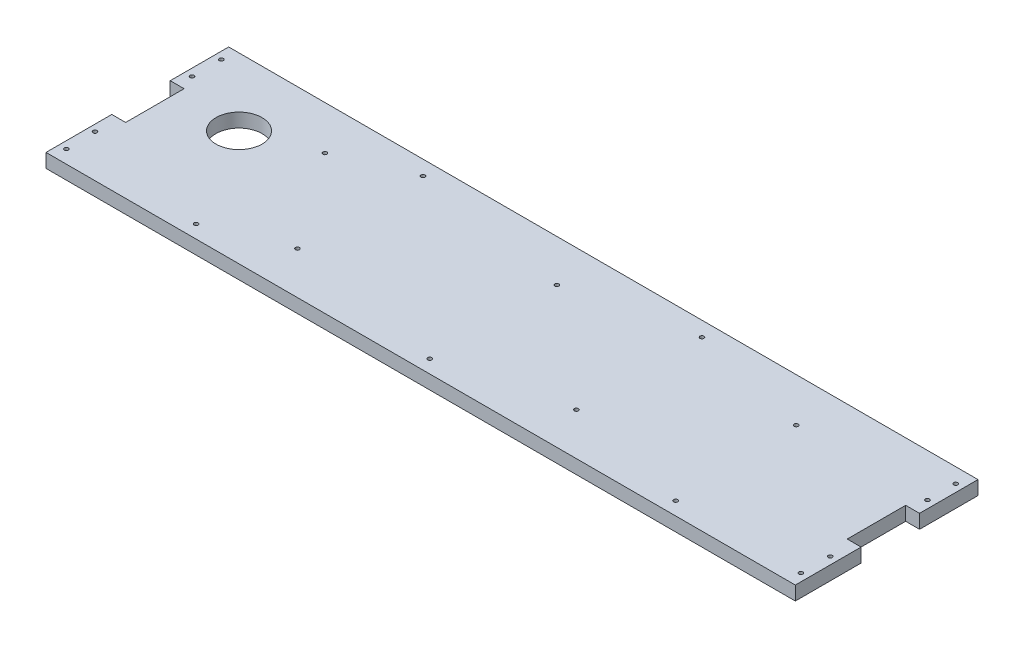
ISO-10303-21;
HEADER;
FILE_DESCRIPTION(('STEP AP214'),'2;1');
FILE_NAME('part.step','',(''),(''),'','','');
FILE_SCHEMA(('AUTOMOTIVE_DESIGN { 1 0 10303 214 1 1 1 1 }'));
ENDSEC;
DATA;
#1=APPLICATION_CONTEXT('core data for automotive mechanical design processes');
#2=APPLICATION_PROTOCOL_DEFINITION('international standard','automotive_design',2000,#1);
#3=PRODUCT_CONTEXT('',#1,'mechanical');
#4=PRODUCT('Part','Part','',(#3));
#5=PRODUCT_RELATED_PRODUCT_CATEGORY('part','',(#4));
#6=PRODUCT_DEFINITION_FORMATION('','',#4);
#7=PRODUCT_DEFINITION_CONTEXT('part definition',#1,'design');
#8=PRODUCT_DEFINITION('design','',#6,#7);
#9=PRODUCT_DEFINITION_SHAPE('','',#8);
#10=(LENGTH_UNIT() NAMED_UNIT(*) SI_UNIT(.MILLI.,.METRE.));
#11=(NAMED_UNIT(*) PLANE_ANGLE_UNIT() SI_UNIT($,.RADIAN.));
#12=(NAMED_UNIT(*) SI_UNIT($,.STERADIAN.) SOLID_ANGLE_UNIT());
#13=UNCERTAINTY_MEASURE_WITH_UNIT(LENGTH_MEASURE(1.E-05),#10,'distance_accuracy_value','');
#14=(GEOMETRIC_REPRESENTATION_CONTEXT(3) GLOBAL_UNCERTAINTY_ASSIGNED_CONTEXT((#13)) GLOBAL_UNIT_ASSIGNED_CONTEXT((#10,
#11,#12)) REPRESENTATION_CONTEXT('',''));
#15=CARTESIAN_POINT('',(0.,0.,0.));
#16=DIRECTION('',(0.,0.,1.));
#17=DIRECTION('',(1.,0.,0.));
#18=AXIS2_PLACEMENT_3D('',#15,#16,#17);
#19=CARTESIAN_POINT('',(-1865.91988168821,543.243550830368,250.));
#20=DIRECTION('',(1.,0.,0.));
#21=DIRECTION('',(0.,0.,-1.));
#22=AXIS2_PLACEMENT_3D('',#19,#20,#21);
#23=PLANE('',#22);
#24=DIRECTION('',(0.,0.,-1.));
#25=VECTOR('',#24,1.);
#26=CARTESIAN_POINT('',(-1865.91988168821,562.243550830368,250.));
#27=LINE('',#26,#25);
#28=CARTESIAN_POINT('',(-1865.91988168821,562.243550830368,250.));
#29=VERTEX_POINT('',#28);
#30=CARTESIAN_POINT('',(-1865.91988168821,562.243550830368,160.));
#31=VERTEX_POINT('',#30);
#32=EDGE_CURVE('E219',#29,#31,#27,.T.);
#33=ORIENTED_EDGE('',*,*,#32,.T.);
#34=DIRECTION('',(0.,1.,0.));
#35=VECTOR('',#34,1.);
#36=CARTESIAN_POINT('',(-1865.91988168821,562.243550830368,160.));
#37=LINE('',#36,#35);
#38=CARTESIAN_POINT('',(-1865.91988168821,543.243550830368,160.));
#39=VERTEX_POINT('',#38);
#40=EDGE_CURVE('E130',#39,#31,#37,.T.);
#41=ORIENTED_EDGE('',*,*,#40,.F.);
#42=DIRECTION('',(0.,0.,-1.));
#43=VECTOR('',#42,1.);
#44=CARTESIAN_POINT('',(-1865.91988168821,543.243550830368,250.));
#45=LINE('',#44,#43);
#46=CARTESIAN_POINT('',(-1865.91988168821,543.243550830368,250.));
#47=VERTEX_POINT('',#46);
#48=EDGE_CURVE('E216',#47,#39,#45,.T.);
#49=ORIENTED_EDGE('',*,*,#48,.F.);
#50=DIRECTION('',(0.,-1.,0.));
#51=VECTOR('',#50,1.);
#52=CARTESIAN_POINT('',(-1865.91988168821,543.243550830368,250.));
#53=LINE('',#52,#51);
#54=EDGE_CURVE('E197',#29,#47,#53,.T.);
#55=ORIENTED_EDGE('',*,*,#54,.F.);
#56=EDGE_LOOP('',(#33,#41,#49,#55));
#57=FACE_BOUND('',#56,.T.);
#58=ADVANCED_FACE('F35',(#57),#23,.F.);
#59=CARTESIAN_POINT('',(-840.458601323636,543.243550830368,250.));
#60=DIRECTION('',(-1.,0.,0.));
#61=DIRECTION('',(0.,0.,1.));
#62=AXIS2_PLACEMENT_3D('',#59,#60,#61);
#63=PLANE('',#62);
#64=DIRECTION('',(0.,0.,-1.));
#65=VECTOR('',#64,1.);
#66=CARTESIAN_POINT('',(-840.458601323636,543.243550830368,250.));
#67=LINE('',#66,#65);
#68=CARTESIAN_POINT('',(-840.458601323636,543.243550830368,250.));
#69=VERTEX_POINT('',#68);
#70=CARTESIAN_POINT('',(-840.458601323636,543.243550830368,160.));
#71=VERTEX_POINT('',#70);
#72=EDGE_CURVE('E212',#69,#71,#67,.T.);
#73=ORIENTED_EDGE('',*,*,#72,.T.);
#74=DIRECTION('',(0.,-1.,0.));
#75=VECTOR('',#74,1.);
#76=CARTESIAN_POINT('',(-840.458601323636,543.243550830368,160.));
#77=LINE('',#76,#75);
#78=CARTESIAN_POINT('',(-840.458601323636,562.243550830368,160.));
#79=VERTEX_POINT('',#78);
#80=EDGE_CURVE('E158',#79,#71,#77,.T.);
#81=ORIENTED_EDGE('',*,*,#80,.F.);
#82=DIRECTION('',(0.,0.,-1.));
#83=VECTOR('',#82,1.);
#84=CARTESIAN_POINT('',(-840.458601323636,562.243550830368,250.));
#85=LINE('',#84,#83);
#86=CARTESIAN_POINT('',(-840.458601323636,562.243550830368,250.));
#87=VERTEX_POINT('',#86);
#88=EDGE_CURVE('E11',#87,#79,#85,.T.);
#89=ORIENTED_EDGE('',*,*,#88,.F.);
#90=DIRECTION('',(0.,1.,0.));
#91=VECTOR('',#90,1.);
#92=CARTESIAN_POINT('',(-840.458601323636,543.243550830368,250.));
#93=LINE('',#92,#91);
#94=EDGE_CURVE('E191',#69,#87,#93,.T.);
#95=ORIENTED_EDGE('',*,*,#94,.F.);
#96=EDGE_LOOP('',(#73,#81,#89,#95));
#97=FACE_BOUND('',#96,.T.);
#98=ADVANCED_FACE('F251',(#97),#63,.F.);
#99=CARTESIAN_POINT('',(-840.458601323636,562.243550830368,79.9999999999997));
#100=VERTEX_POINT('',#99);
#101=CARTESIAN_POINT('',(-840.458601323636,562.243550830368,0.));
#102=VERTEX_POINT('',#101);
#103=EDGE_CURVE('E43',#100,#102,#85,.T.);
#104=ORIENTED_EDGE('',*,*,#103,.F.);
#105=DIRECTION('',(0.,1.,0.));
#106=VECTOR('',#105,1.);
#107=CARTESIAN_POINT('',(-840.458601323636,543.243550830368,79.9999999999997));
#108=LINE('',#107,#106);
#109=CARTESIAN_POINT('',(-840.458601323636,543.243550830368,79.9999999999997));
#110=VERTEX_POINT('',#109);
#111=EDGE_CURVE('E165',#110,#100,#108,.T.);
#112=ORIENTED_EDGE('',*,*,#111,.F.);
#113=CARTESIAN_POINT('',(-840.458601323636,543.243550830368,0.));
#114=VERTEX_POINT('',#113);
#115=EDGE_CURVE('E201',#110,#114,#67,.T.);
#116=ORIENTED_EDGE('',*,*,#115,.T.);
#117=DIRECTION('',(0.,1.,0.));
#118=VECTOR('',#117,1.);
#119=CARTESIAN_POINT('',(-840.458601323636,543.243550830368,0.));
#120=LINE('',#119,#118);
#121=EDGE_CURVE('E188',#114,#102,#120,.T.);
#122=ORIENTED_EDGE('',*,*,#121,.T.);
#123=EDGE_LOOP('',(#104,#112,#116,#122));
#124=FACE_BOUND('',#123,.T.);
#125=ADVANCED_FACE('F37',(#124),#63,.F.);
#126=CARTESIAN_POINT('',(-840.458601323636,562.243550830368,250.));
#127=DIRECTION('',(0.,-1.,0.));
#128=DIRECTION('',(1.,0.,0.));
#129=AXIS2_PLACEMENT_3D('',#126,#127,#128);
#130=PLANE('',#129);
#131=CARTESIAN_POINT('',(-850.780626103802,562.243550830368,20.3000000000015));
#132=DIRECTION('',(0.,1.,0.));
#133=DIRECTION('',(0.,0.,1.));
#134=AXIS2_PLACEMENT_3D('',#131,#132,#133);
#135=CIRCLE('',#134,2.75000000000003);
#136=CARTESIAN_POINT('',(-850.780626103802,562.243550830368,23.0500000000015));
#137=VERTEX_POINT('',#136);
#138=EDGE_CURVE('E273',#137,#137,#135,.T.);
#139=ORIENTED_EDGE('',*,*,#138,.F.);
#140=EDGE_LOOP('',(#139));
#141=FACE_BOUND('',#140,.T.);
#142=CARTESIAN_POINT('',(-1029.36381668345,562.243550830368,60.0000000000008));
#143=DIRECTION('',(0.,1.,0.));
#144=DIRECTION('',(0.,0.,1.));
#145=AXIS2_PLACEMENT_3D('',#142,#143,#144);
#146=CIRCLE('',#145,2.75000000000003);
#147=CARTESIAN_POINT('',(-1029.36381668345,562.243550830368,62.7500000000009));
#148=VERTEX_POINT('',#147);
#149=EDGE_CURVE('E277',#148,#148,#146,.T.);
#150=ORIENTED_EDGE('',*,*,#149,.F.);
#151=EDGE_LOOP('',(#150));
#152=FACE_BOUND('',#151,.T.);
#153=CARTESIAN_POINT('',(-1197.99480489754,562.243550830368,20.1973891975282));
#154=DIRECTION('',(0.,1.,0.));
#155=DIRECTION('',(0.,0.,1.));
#156=AXIS2_PLACEMENT_3D('',#153,#154,#155);
#157=CIRCLE('',#156,2.75000000000003);
#158=CARTESIAN_POINT('',(-1197.99480489754,562.243550830368,22.9473891975282));
#159=VERTEX_POINT('',#158);
#160=EDGE_CURVE('E281',#159,#159,#157,.T.);
#161=ORIENTED_EDGE('',*,*,#160,.F.);
#162=EDGE_LOOP('',(#161));
#163=FACE_BOUND('',#162,.T.);
#164=CARTESIAN_POINT('',(-1359.19979162814,562.243550830368,57.550000000074));
#165=DIRECTION('',(0.,1.,0.));
#166=DIRECTION('',(0.,0.,1.));
#167=AXIS2_PLACEMENT_3D('',#164,#165,#166);
#168=CIRCLE('',#167,2.75000000000003);
#169=CARTESIAN_POINT('',(-1359.19979162814,562.243550830368,60.300000000074));
#170=VERTEX_POINT('',#169);
#171=EDGE_CURVE('E285',#170,#170,#168,.T.);
#172=ORIENTED_EDGE('',*,*,#171,.F.);
#173=EDGE_LOOP('',(#172));
#174=FACE_BOUND('',#173,.T.);
#175=CARTESIAN_POINT('',(-1579.86777026992,562.243550830368,20.0845358239827));
#176=DIRECTION('',(0.,1.,0.));
#177=DIRECTION('',(0.,0.,1.));
#178=AXIS2_PLACEMENT_3D('',#175,#176,#177);
#179=CIRCLE('',#178,2.75000000000003);
#180=CARTESIAN_POINT('',(-1579.86777026992,562.243550830368,22.8345358239827));
#181=VERTEX_POINT('',#180);
#182=EDGE_CURVE('E289',#181,#181,#179,.T.);
#183=ORIENTED_EDGE('',*,*,#182,.F.);
#184=EDGE_LOOP('',(#183));
#185=FACE_BOUND('',#184,.T.);
#186=CARTESIAN_POINT('',(-1579.86777026992,562.243550830368,192.000000000786));
#187=DIRECTION('',(0.,1.,0.));
#188=DIRECTION('',(0.,0.,1.));
#189=AXIS2_PLACEMENT_3D('',#186,#187,#188);
#190=CIRCLE('',#189,2.75000000000003);
#191=CARTESIAN_POINT('',(-1579.86777026992,562.243550830368,194.750000000786));
#192=VERTEX_POINT('',#191);
#193=EDGE_CURVE('E293',#192,#192,#190,.T.);
#194=ORIENTED_EDGE('',*,*,#193,.F.);
#195=EDGE_LOOP('',(#194));
#196=FACE_BOUND('',#195,.T.);
#197=CARTESIAN_POINT('',(-1197.99480489754,562.243550830368,192.000000000786));
#198=DIRECTION('',(0.,1.,0.));
#199=DIRECTION('',(0.,0.,1.));
#200=AXIS2_PLACEMENT_3D('',#197,#198,#199);
#201=CIRCLE('',#200,2.75000000000003);
#202=CARTESIAN_POINT('',(-1197.99480489754,562.243550830368,194.750000000786));
#203=VERTEX_POINT('',#202);
#204=EDGE_CURVE('E297',#203,#203,#201,.T.);
#205=ORIENTED_EDGE('',*,*,#204,.F.);
#206=EDGE_LOOP('',(#205));
#207=FACE_BOUND('',#206,.T.);
#208=CARTESIAN_POINT('',(-1022.31748136272,562.243550830368,232.000000000787));
#209=DIRECTION('',(0.,1.,0.));
#210=DIRECTION('',(0.,0.,1.));
#211=AXIS2_PLACEMENT_3D('',#208,#209,#210);
#212=CIRCLE('',#211,2.75000000000003);
#213=CARTESIAN_POINT('',(-1022.31748136272,562.243550830368,234.750000000787));
#214=VERTEX_POINT('',#213);
#215=EDGE_CURVE('E301',#214,#214,#212,.T.);
#216=ORIENTED_EDGE('',*,*,#215,.F.);
#217=EDGE_LOOP('',(#216));
#218=FACE_BOUND('',#217,.T.);
#219=CARTESIAN_POINT('',(-850.905070025992,562.243550830368,232.000000000787));
#220=DIRECTION('',(0.,1.,0.));
#221=DIRECTION('',(0.,0.,1.));
#222=AXIS2_PLACEMENT_3D('',#219,#220,#221);
#223=CIRCLE('',#222,2.75000000000003);
#224=CARTESIAN_POINT('',(-850.905070025992,562.243550830368,234.750000000787));
#225=VERTEX_POINT('',#224);
#226=EDGE_CURVE('E305',#225,#225,#223,.T.);
#227=ORIENTED_EDGE('',*,*,#226,.F.);
#228=EDGE_LOOP('',(#227));
#229=FACE_BOUND('',#228,.T.);
#230=CARTESIAN_POINT('',(-1358.74804949648,562.243550830368,232.000000000787));
#231=DIRECTION('',(0.,1.,0.));
#232=DIRECTION('',(0.,0.,1.));
#233=AXIS2_PLACEMENT_3D('',#230,#231,#232);
#234=CIRCLE('',#233,2.75000000000003);
#235=CARTESIAN_POINT('',(-1358.74804949648,562.243550830368,234.750000000787));
#236=VERTEX_POINT('',#235);
#237=EDGE_CURVE('E309',#236,#236,#234,.T.);
#238=ORIENTED_EDGE('',*,*,#237,.F.);
#239=EDGE_LOOP('',(#238));
#240=FACE_BOUND('',#239,.T.);
#241=CARTESIAN_POINT('',(-1678.43137335777,562.243550830368,232.000000000787));
#242=DIRECTION('',(0.,1.,0.));
#243=DIRECTION('',(0.,0.,1.));
#244=AXIS2_PLACEMENT_3D('',#241,#242,#243);
#245=CIRCLE('',#244,2.75000000000003);
#246=CARTESIAN_POINT('',(-1678.43137335777,562.243550830368,234.750000000787));
#247=VERTEX_POINT('',#246);
#248=EDGE_CURVE('E313',#247,#247,#245,.T.);
#249=ORIENTED_EDGE('',*,*,#248,.F.);
#250=EDGE_LOOP('',(#249));
#251=FACE_BOUND('',#250,.T.);
#252=CARTESIAN_POINT('',(-1856.03128538777,562.243550830368,232.000000000787));
#253=DIRECTION('',(0.,1.,0.));
#254=DIRECTION('',(0.,0.,1.));
#255=AXIS2_PLACEMENT_3D('',#252,#253,#254);
#256=CIRCLE('',#255,2.75000000000003);
#257=CARTESIAN_POINT('',(-1856.03128538777,562.243550830368,234.750000000787));
#258=VERTEX_POINT('',#257);
#259=EDGE_CURVE('E317',#258,#258,#256,.T.);
#260=ORIENTED_EDGE('',*,*,#259,.F.);
#261=EDGE_LOOP('',(#260));
#262=FACE_BOUND('',#261,.T.);
#263=CARTESIAN_POINT('',(-1856.03128538777,562.243550830368,20.002922336888));
#264=DIRECTION('',(0.,1.,0.));
#265=DIRECTION('',(0.,0.,1.));
#266=AXIS2_PLACEMENT_3D('',#263,#264,#265);
#267=CIRCLE('',#266,2.75000000000003);
#268=CARTESIAN_POINT('',(-1856.03128538777,562.243550830368,22.752922336888));
#269=VERTEX_POINT('',#268);
#270=EDGE_CURVE('E321',#269,#269,#267,.T.);
#271=ORIENTED_EDGE('',*,*,#270,.F.);
#272=EDGE_LOOP('',(#271));
#273=FACE_BOUND('',#272,.T.);
#274=CARTESIAN_POINT('',(-1856.03128538777,562.243550830368,60.0000000000014));
#275=DIRECTION('',(0.,1.,0.));
#276=DIRECTION('',(0.,0.,1.));
#277=AXIS2_PLACEMENT_3D('',#274,#275,#276);
#278=CIRCLE('',#277,2.75000000000003);
#279=CARTESIAN_POINT('',(-1856.03128538777,562.243550830368,62.7500000000014));
#280=VERTEX_POINT('',#279);
#281=EDGE_CURVE('E325',#280,#280,#278,.T.);
#282=ORIENTED_EDGE('',*,*,#281,.F.);
#283=EDGE_LOOP('',(#282));
#284=FACE_BOUND('',#283,.T.);
#285=CARTESIAN_POINT('',(-850.780626103801,562.243550830368,58.8568143987564));
#286=DIRECTION('',(0.,1.,0.));
#287=DIRECTION('',(0.,0.,1.));
#288=AXIS2_PLACEMENT_3D('',#285,#286,#287);
#289=CIRCLE('',#288,2.75000000000003);
#290=CARTESIAN_POINT('',(-850.780626103801,562.243550830368,61.6068143987564));
#291=VERTEX_POINT('',#290);
#292=EDGE_CURVE('E329',#291,#291,#289,.T.);
#293=ORIENTED_EDGE('',*,*,#292,.F.);
#294=EDGE_LOOP('',(#293));
#295=FACE_BOUND('',#294,.T.);
#296=CARTESIAN_POINT('',(-1674.22514924527,562.243550830368,60.0000000000013));
#297=DIRECTION('',(0.,1.,0.));
#298=DIRECTION('',(0.,0.,1.));
#299=AXIS2_PLACEMENT_3D('',#296,#297,#298);
#300=CIRCLE('',#299,2.75000000000003);
#301=CARTESIAN_POINT('',(-1674.22514924527,562.243550830368,62.7500000000013));
#302=VERTEX_POINT('',#301);
#303=EDGE_CURVE('E333',#302,#302,#300,.T.);
#304=ORIENTED_EDGE('',*,*,#303,.F.);
#305=EDGE_LOOP('',(#304));
#306=FACE_BOUND('',#305,.T.);
#307=CARTESIAN_POINT('',(-1856.95185401541,562.243550830368,191.925882031555));
#308=DIRECTION('',(0.,1.,0.));
#309=DIRECTION('',(0.,0.,1.));
#310=AXIS2_PLACEMENT_3D('',#307,#308,#309);
#311=CIRCLE('',#310,2.75000000000003);
#312=CARTESIAN_POINT('',(-1856.95185401541,562.243550830368,194.675882031555));
#313=VERTEX_POINT('',#312);
#314=EDGE_CURVE('E337',#313,#313,#311,.T.);
#315=ORIENTED_EDGE('',*,*,#314,.F.);
#316=EDGE_LOOP('',(#315));
#317=FACE_BOUND('',#316,.T.);
#318=CARTESIAN_POINT('',(-850.436105742602,562.243550830368,192.200966052042));
#319=DIRECTION('',(0.,1.,0.));
#320=DIRECTION('',(0.,0.,1.));
#321=AXIS2_PLACEMENT_3D('',#318,#319,#320);
#322=CIRCLE('',#321,2.75000000000003);
#323=CARTESIAN_POINT('',(-850.436105742602,562.243550830368,194.950966052042));
#324=VERTEX_POINT('',#323);
#325=EDGE_CURVE('E340',#324,#324,#322,.T.);
#326=ORIENTED_EDGE('',*,*,#325,.F.);
#327=EDGE_LOOP('',(#326));
#328=FACE_BOUND('',#327,.T.);
#329=DIRECTION('',(0.,0.,-1.));
#330=VECTOR('',#329,1.);
#331=CARTESIAN_POINT('',(-1846.91988168821,562.243550830368,160.));
#332=LINE('',#331,#330);
#333=CARTESIAN_POINT('',(-1846.91988168821,562.243550830368,160.));
#334=VERTEX_POINT('',#333);
#335=CARTESIAN_POINT('',(-1846.91988168821,562.243550830368,80.0000000000002));
#336=VERTEX_POINT('',#335);
#337=EDGE_CURVE('E139',#334,#336,#332,.T.);
#338=ORIENTED_EDGE('',*,*,#337,.F.);
#339=DIRECTION('',(-1.,0.,0.));
#340=VECTOR('',#339,1.);
#341=CARTESIAN_POINT('',(-1846.91988168821,562.243550830368,160.));
#342=LINE('',#341,#340);
#343=EDGE_CURVE('E125',#334,#31,#342,.T.);
#344=ORIENTED_EDGE('',*,*,#343,.T.);
#345=ORIENTED_EDGE('',*,*,#32,.F.);
#346=DIRECTION('',(-1.,0.,0.));
#347=VECTOR('',#346,1.);
#348=CARTESIAN_POINT('',(-840.458601323636,562.243550830368,250.));
#349=LINE('',#348,#347);
#350=EDGE_CURVE('E194',#87,#29,#349,.T.);
#351=ORIENTED_EDGE('',*,*,#350,.F.);
#352=ORIENTED_EDGE('',*,*,#88,.T.);
#353=DIRECTION('',(1.,0.,0.));
#354=VECTOR('',#353,1.);
#355=CARTESIAN_POINT('',(-859.458601323636,562.243550830368,160.));
#356=LINE('',#355,#354);
#357=CARTESIAN_POINT('',(-859.458601323636,562.243550830368,160.));
#358=VERTEX_POINT('',#357);
#359=EDGE_CURVE('E175',#358,#79,#356,.T.);
#360=ORIENTED_EDGE('',*,*,#359,.F.);
#361=DIRECTION('',(0.,0.,1.));
#362=VECTOR('',#361,1.);
#363=CARTESIAN_POINT('',(-859.458601323636,562.243550830368,160.));
#364=LINE('',#363,#362);
#365=CARTESIAN_POINT('',(-859.458601323636,562.243550830368,79.9999999999997));
#366=VERTEX_POINT('',#365);
#367=EDGE_CURVE('E170',#366,#358,#364,.T.);
#368=ORIENTED_EDGE('',*,*,#367,.F.);
#369=DIRECTION('',(1.,0.,0.));
#370=VECTOR('',#369,1.);
#371=CARTESIAN_POINT('',(-859.458601323636,562.243550830368,79.9999999999997));
#372=LINE('',#371,#370);
#373=EDGE_CURVE('E178',#366,#100,#372,.T.);
#374=ORIENTED_EDGE('',*,*,#373,.T.);
#375=ORIENTED_EDGE('',*,*,#103,.T.);
#376=DIRECTION('',(-1.,0.,0.));
#377=VECTOR('',#376,1.);
#378=CARTESIAN_POINT('',(-840.458601323636,562.243550830368,0.));
#379=LINE('',#378,#377);
#380=CARTESIAN_POINT('',(-1865.91988168821,562.243550830368,0.));
#381=VERTEX_POINT('',#380);
#382=EDGE_CURVE('E204',#102,#381,#379,.T.);
#383=ORIENTED_EDGE('',*,*,#382,.T.);
#384=CARTESIAN_POINT('',(-1865.91988168821,562.243550830368,80.0000000000002));
#385=VERTEX_POINT('',#384);
#386=EDGE_CURVE('E218',#385,#381,#27,.T.);
#387=ORIENTED_EDGE('',*,*,#386,.F.);
#388=DIRECTION('',(-1.,0.,0.));
#389=VECTOR('',#388,1.);
#390=CARTESIAN_POINT('',(-1846.91988168821,562.243550830368,80.0000000000002));
#391=LINE('',#390,#389);
#392=EDGE_CURVE('E135',#336,#385,#391,.T.);
#393=ORIENTED_EDGE('',*,*,#392,.F.);
#394=EDGE_LOOP('',(#338,#344,#345,#351,#352,#360,#368,#374,#375,#383,#387,#393));
#395=FACE_BOUND('',#394,.T.);
#396=CARTESIAN_POINT('',(-1759.4144639411,562.243550830368,92.3708811468323));
#397=DIRECTION('',(0.,-1.,0.));
#398=DIRECTION('',(1.,0.,0.));
#399=AXIS2_PLACEMENT_3D('',#396,#397,#398);
#400=CIRCLE('',#399,31.4746452947953);
#401=CARTESIAN_POINT('',(-1727.93981864631,562.243550830368,92.3708811468323));
#402=VERTEX_POINT('',#401);
#403=EDGE_CURVE('E185',#402,#402,#400,.T.);
#404=ORIENTED_EDGE('',*,*,#403,.T.);
#405=EDGE_LOOP('',(#404));
#406=FACE_BOUND('',#405,.T.);
#407=ADVANCED_FACE('F145',(#141,#152,#163,#174,#185,#196,#207,#218,#229,#240,#251,#262,#273,
#284,#295,#306,#317,#328,#395,#406),#130,.F.);
#408=CARTESIAN_POINT('',(-1865.91988168821,543.243550830368,80.0000000000002));
#409=VERTEX_POINT('',#408);
#410=CARTESIAN_POINT('',(-1865.91988168821,543.243550830368,0.));
#411=VERTEX_POINT('',#410);
#412=EDGE_CURVE('E215',#409,#411,#45,.T.);
#413=ORIENTED_EDGE('',*,*,#412,.F.);
#414=DIRECTION('',(0.,-1.,0.));
#415=VECTOR('',#414,1.);
#416=CARTESIAN_POINT('',(-1865.91988168821,562.243550830368,80.0000000000002));
#417=LINE('',#416,#415);
#418=EDGE_CURVE('E143',#385,#409,#417,.T.);
#419=ORIENTED_EDGE('',*,*,#418,.F.);
#420=ORIENTED_EDGE('',*,*,#386,.T.);
#421=DIRECTION('',(0.,-1.,0.));
#422=VECTOR('',#421,1.);
#423=CARTESIAN_POINT('',(-1865.91988168821,543.243550830368,0.));
#424=LINE('',#423,#422);
#425=EDGE_CURVE('E207',#381,#411,#424,.T.);
#426=ORIENTED_EDGE('',*,*,#425,.T.);
#427=EDGE_LOOP('',(#413,#419,#420,#426));
#428=FACE_BOUND('',#427,.T.);
#429=ADVANCED_FACE('F225',(#428),#23,.F.);
#430=CARTESIAN_POINT('',(-840.458601323636,543.243550830368,250.));
#431=DIRECTION('',(0.,1.,0.));
#432=DIRECTION('',(-1.,0.,0.));
#433=AXIS2_PLACEMENT_3D('',#430,#431,#432);
#434=PLANE('',#433);
#435=CARTESIAN_POINT('',(-850.780626103802,543.243550830368,20.3000000000015));
#436=DIRECTION('',(0.,1.,0.));
#437=DIRECTION('',(0.,0.,1.));
#438=AXIS2_PLACEMENT_3D('',#435,#436,#437);
#439=CIRCLE('',#438,2.75000000000003);
#440=CARTESIAN_POINT('',(-850.780626103802,543.243550830368,23.0500000000015));
#441=VERTEX_POINT('',#440);
#442=EDGE_CURVE('E409',#441,#441,#439,.T.);
#443=ORIENTED_EDGE('',*,*,#442,.T.);
#444=EDGE_LOOP('',(#443));
#445=FACE_BOUND('',#444,.T.);
#446=CARTESIAN_POINT('',(-1029.36381668345,543.243550830368,60.0000000000008));
#447=DIRECTION('',(0.,1.,0.));
#448=DIRECTION('',(0.,0.,1.));
#449=AXIS2_PLACEMENT_3D('',#446,#447,#448);
#450=CIRCLE('',#449,2.75000000000003);
#451=CARTESIAN_POINT('',(-1029.36381668345,543.243550830368,62.7500000000009));
#452=VERTEX_POINT('',#451);
#453=EDGE_CURVE('E405',#452,#452,#450,.T.);
#454=ORIENTED_EDGE('',*,*,#453,.T.);
#455=EDGE_LOOP('',(#454));
#456=FACE_BOUND('',#455,.T.);
#457=CARTESIAN_POINT('',(-1197.99480489754,543.243550830368,20.1973891975282));
#458=DIRECTION('',(0.,1.,0.));
#459=DIRECTION('',(0.,0.,1.));
#460=AXIS2_PLACEMENT_3D('',#457,#458,#459);
#461=CIRCLE('',#460,2.75000000000003);
#462=CARTESIAN_POINT('',(-1197.99480489754,543.243550830368,22.9473891975282));
#463=VERTEX_POINT('',#462);
#464=EDGE_CURVE('E401',#463,#463,#461,.T.);
#465=ORIENTED_EDGE('',*,*,#464,.T.);
#466=EDGE_LOOP('',(#465));
#467=FACE_BOUND('',#466,.T.);
#468=CARTESIAN_POINT('',(-1359.19979162814,543.243550830368,57.550000000074));
#469=DIRECTION('',(0.,1.,0.));
#470=DIRECTION('',(0.,0.,1.));
#471=AXIS2_PLACEMENT_3D('',#468,#469,#470);
#472=CIRCLE('',#471,2.75000000000003);
#473=CARTESIAN_POINT('',(-1359.19979162814,543.243550830368,60.300000000074));
#474=VERTEX_POINT('',#473);
#475=EDGE_CURVE('E397',#474,#474,#472,.T.);
#476=ORIENTED_EDGE('',*,*,#475,.T.);
#477=EDGE_LOOP('',(#476));
#478=FACE_BOUND('',#477,.T.);
#479=CARTESIAN_POINT('',(-1579.86777026992,543.243550830368,20.0845358239827));
#480=DIRECTION('',(0.,1.,0.));
#481=DIRECTION('',(0.,0.,1.));
#482=AXIS2_PLACEMENT_3D('',#479,#480,#481);
#483=CIRCLE('',#482,2.75000000000003);
#484=CARTESIAN_POINT('',(-1579.86777026992,543.243550830368,22.8345358239827));
#485=VERTEX_POINT('',#484);
#486=EDGE_CURVE('E393',#485,#485,#483,.T.);
#487=ORIENTED_EDGE('',*,*,#486,.T.);
#488=EDGE_LOOP('',(#487));
#489=FACE_BOUND('',#488,.T.);
#490=CARTESIAN_POINT('',(-1579.86777026992,543.243550830368,192.000000000786));
#491=DIRECTION('',(0.,1.,0.));
#492=DIRECTION('',(0.,0.,1.));
#493=AXIS2_PLACEMENT_3D('',#490,#491,#492);
#494=CIRCLE('',#493,2.75000000000003);
#495=CARTESIAN_POINT('',(-1579.86777026992,543.243550830368,194.750000000786));
#496=VERTEX_POINT('',#495);
#497=EDGE_CURVE('E389',#496,#496,#494,.T.);
#498=ORIENTED_EDGE('',*,*,#497,.T.);
#499=EDGE_LOOP('',(#498));
#500=FACE_BOUND('',#499,.T.);
#501=CARTESIAN_POINT('',(-1197.99480489754,543.243550830368,192.000000000786));
#502=DIRECTION('',(0.,1.,0.));
#503=DIRECTION('',(0.,0.,1.));
#504=AXIS2_PLACEMENT_3D('',#501,#502,#503);
#505=CIRCLE('',#504,2.75000000000003);
#506=CARTESIAN_POINT('',(-1197.99480489754,543.243550830368,194.750000000786));
#507=VERTEX_POINT('',#506);
#508=EDGE_CURVE('E385',#507,#507,#505,.T.);
#509=ORIENTED_EDGE('',*,*,#508,.T.);
#510=EDGE_LOOP('',(#509));
#511=FACE_BOUND('',#510,.T.);
#512=CARTESIAN_POINT('',(-1022.31748136272,543.243550830368,232.000000000787));
#513=DIRECTION('',(0.,1.,0.));
#514=DIRECTION('',(0.,0.,1.));
#515=AXIS2_PLACEMENT_3D('',#512,#513,#514);
#516=CIRCLE('',#515,2.75000000000003);
#517=CARTESIAN_POINT('',(-1022.31748136272,543.243550830368,234.750000000787));
#518=VERTEX_POINT('',#517);
#519=EDGE_CURVE('E381',#518,#518,#516,.T.);
#520=ORIENTED_EDGE('',*,*,#519,.T.);
#521=EDGE_LOOP('',(#520));
#522=FACE_BOUND('',#521,.T.);
#523=CARTESIAN_POINT('',(-850.905070025992,543.243550830368,232.000000000787));
#524=DIRECTION('',(0.,1.,0.));
#525=DIRECTION('',(0.,0.,1.));
#526=AXIS2_PLACEMENT_3D('',#523,#524,#525);
#527=CIRCLE('',#526,2.75000000000003);
#528=CARTESIAN_POINT('',(-850.905070025992,543.243550830368,234.750000000787));
#529=VERTEX_POINT('',#528);
#530=EDGE_CURVE('E377',#529,#529,#527,.T.);
#531=ORIENTED_EDGE('',*,*,#530,.T.);
#532=EDGE_LOOP('',(#531));
#533=FACE_BOUND('',#532,.T.);
#534=CARTESIAN_POINT('',(-1358.74804949648,543.243550830368,232.000000000787));
#535=DIRECTION('',(0.,1.,0.));
#536=DIRECTION('',(0.,0.,1.));
#537=AXIS2_PLACEMENT_3D('',#534,#535,#536);
#538=CIRCLE('',#537,2.75000000000003);
#539=CARTESIAN_POINT('',(-1358.74804949648,543.243550830368,234.750000000787));
#540=VERTEX_POINT('',#539);
#541=EDGE_CURVE('E373',#540,#540,#538,.T.);
#542=ORIENTED_EDGE('',*,*,#541,.T.);
#543=EDGE_LOOP('',(#542));
#544=FACE_BOUND('',#543,.T.);
#545=CARTESIAN_POINT('',(-1678.43137335777,543.243550830368,232.000000000787));
#546=DIRECTION('',(0.,1.,0.));
#547=DIRECTION('',(0.,0.,1.));
#548=AXIS2_PLACEMENT_3D('',#545,#546,#547);
#549=CIRCLE('',#548,2.75000000000003);
#550=CARTESIAN_POINT('',(-1678.43137335777,543.243550830368,234.750000000787));
#551=VERTEX_POINT('',#550);
#552=EDGE_CURVE('E369',#551,#551,#549,.T.);
#553=ORIENTED_EDGE('',*,*,#552,.T.);
#554=EDGE_LOOP('',(#553));
#555=FACE_BOUND('',#554,.T.);
#556=CARTESIAN_POINT('',(-1856.03128538777,543.243550830368,232.000000000787));
#557=DIRECTION('',(0.,1.,0.));
#558=DIRECTION('',(0.,0.,1.));
#559=AXIS2_PLACEMENT_3D('',#556,#557,#558);
#560=CIRCLE('',#559,2.75000000000003);
#561=CARTESIAN_POINT('',(-1856.03128538777,543.243550830368,234.750000000787));
#562=VERTEX_POINT('',#561);
#563=EDGE_CURVE('E365',#562,#562,#560,.T.);
#564=ORIENTED_EDGE('',*,*,#563,.T.);
#565=EDGE_LOOP('',(#564));
#566=FACE_BOUND('',#565,.T.);
#567=CARTESIAN_POINT('',(-1856.03128538777,543.243550830368,20.002922336888));
#568=DIRECTION('',(0.,1.,0.));
#569=DIRECTION('',(0.,0.,1.));
#570=AXIS2_PLACEMENT_3D('',#567,#568,#569);
#571=CIRCLE('',#570,2.75000000000003);
#572=CARTESIAN_POINT('',(-1856.03128538777,543.243550830368,22.752922336888));
#573=VERTEX_POINT('',#572);
#574=EDGE_CURVE('E361',#573,#573,#571,.T.);
#575=ORIENTED_EDGE('',*,*,#574,.T.);
#576=EDGE_LOOP('',(#575));
#577=FACE_BOUND('',#576,.T.);
#578=CARTESIAN_POINT('',(-1856.03128538777,543.243550830368,60.0000000000014));
#579=DIRECTION('',(0.,1.,0.));
#580=DIRECTION('',(0.,0.,1.));
#581=AXIS2_PLACEMENT_3D('',#578,#579,#580);
#582=CIRCLE('',#581,2.75000000000003);
#583=CARTESIAN_POINT('',(-1856.03128538777,543.243550830368,62.7500000000014));
#584=VERTEX_POINT('',#583);
#585=EDGE_CURVE('E357',#584,#584,#582,.T.);
#586=ORIENTED_EDGE('',*,*,#585,.T.);
#587=EDGE_LOOP('',(#586));
#588=FACE_BOUND('',#587,.T.);
#589=CARTESIAN_POINT('',(-850.780626103801,543.243550830368,58.8568143987564));
#590=DIRECTION('',(0.,1.,0.));
#591=DIRECTION('',(0.,0.,1.));
#592=AXIS2_PLACEMENT_3D('',#589,#590,#591);
#593=CIRCLE('',#592,2.75000000000003);
#594=CARTESIAN_POINT('',(-850.780626103801,543.243550830368,61.6068143987564));
#595=VERTEX_POINT('',#594);
#596=EDGE_CURVE('E353',#595,#595,#593,.T.);
#597=ORIENTED_EDGE('',*,*,#596,.T.);
#598=EDGE_LOOP('',(#597));
#599=FACE_BOUND('',#598,.T.);
#600=CARTESIAN_POINT('',(-1674.22514924527,543.243550830368,60.0000000000013));
#601=DIRECTION('',(0.,1.,0.));
#602=DIRECTION('',(0.,0.,1.));
#603=AXIS2_PLACEMENT_3D('',#600,#601,#602);
#604=CIRCLE('',#603,2.75000000000003);
#605=CARTESIAN_POINT('',(-1674.22514924527,543.243550830368,62.7500000000013));
#606=VERTEX_POINT('',#605);
#607=EDGE_CURVE('E349',#606,#606,#604,.T.);
#608=ORIENTED_EDGE('',*,*,#607,.T.);
#609=EDGE_LOOP('',(#608));
#610=FACE_BOUND('',#609,.T.);
#611=CARTESIAN_POINT('',(-1856.95185401541,543.243550830368,191.925882031555));
#612=DIRECTION('',(0.,1.,0.));
#613=DIRECTION('',(0.,0.,1.));
#614=AXIS2_PLACEMENT_3D('',#611,#612,#613);
#615=CIRCLE('',#614,2.75000000000003);
#616=CARTESIAN_POINT('',(-1856.95185401541,543.243550830368,194.675882031555));
#617=VERTEX_POINT('',#616);
#618=EDGE_CURVE('E342',#617,#617,#615,.T.);
#619=ORIENTED_EDGE('',*,*,#618,.T.);
#620=EDGE_LOOP('',(#619));
#621=FACE_BOUND('',#620,.T.);
#622=CARTESIAN_POINT('',(-850.436105742602,543.243550830368,192.200966052042));
#623=DIRECTION('',(0.,1.,0.));
#624=DIRECTION('',(0.,0.,1.));
#625=AXIS2_PLACEMENT_3D('',#622,#623,#624);
#626=CIRCLE('',#625,2.75000000000003);
#627=CARTESIAN_POINT('',(-850.436105742602,543.243550830368,194.950966052042));
#628=VERTEX_POINT('',#627);
#629=EDGE_CURVE('E154',#628,#628,#626,.T.);
#630=ORIENTED_EDGE('',*,*,#629,.T.);
#631=EDGE_LOOP('',(#630));
#632=FACE_BOUND('',#631,.T.);
#633=ORIENTED_EDGE('',*,*,#48,.T.);
#634=DIRECTION('',(-1.,0.,0.));
#635=VECTOR('',#634,1.);
#636=CARTESIAN_POINT('',(-1846.91988168821,543.243550830368,160.));
#637=LINE('',#636,#635);
#638=CARTESIAN_POINT('',(-1846.91988168821,543.243550830368,160.));
#639=VERTEX_POINT('',#638);
#640=EDGE_CURVE('E156',#639,#39,#637,.T.);
#641=ORIENTED_EDGE('',*,*,#640,.F.);
#642=DIRECTION('',(0.,0.,1.));
#643=VECTOR('',#642,1.);
#644=CARTESIAN_POINT('',(-1846.91988168821,543.243550830368,160.));
#645=LINE('',#644,#643);
#646=CARTESIAN_POINT('',(-1846.91988168821,543.243550830368,80.0000000000002));
#647=VERTEX_POINT('',#646);
#648=EDGE_CURVE('E136',#647,#639,#645,.T.);
#649=ORIENTED_EDGE('',*,*,#648,.F.);
#650=DIRECTION('',(-1.,0.,0.));
#651=VECTOR('',#650,1.);
#652=CARTESIAN_POINT('',(-1846.91988168821,543.243550830368,80.0000000000002));
#653=LINE('',#652,#651);
#654=EDGE_CURVE('E159',#647,#409,#653,.T.);
#655=ORIENTED_EDGE('',*,*,#654,.T.);
#656=ORIENTED_EDGE('',*,*,#412,.T.);
#657=DIRECTION('',(1.,0.,0.));
#658=VECTOR('',#657,1.);
#659=CARTESIAN_POINT('',(-840.458601323636,543.243550830368,0.));
#660=LINE('',#659,#658);
#661=EDGE_CURVE('E195',#411,#114,#660,.T.);
#662=ORIENTED_EDGE('',*,*,#661,.T.);
#663=ORIENTED_EDGE('',*,*,#115,.F.);
#664=DIRECTION('',(1.,0.,0.));
#665=VECTOR('',#664,1.);
#666=CARTESIAN_POINT('',(-859.458601323636,543.243550830368,79.9999999999997));
#667=LINE('',#666,#665);
#668=CARTESIAN_POINT('',(-859.458601323636,543.243550830368,79.9999999999997));
#669=VERTEX_POINT('',#668);
#670=EDGE_CURVE('E181',#669,#110,#667,.T.);
#671=ORIENTED_EDGE('',*,*,#670,.F.);
#672=DIRECTION('',(0.,0.,-1.));
#673=VECTOR('',#672,1.);
#674=CARTESIAN_POINT('',(-859.458601323636,543.243550830368,160.));
#675=LINE('',#674,#673);
#676=CARTESIAN_POINT('',(-859.458601323636,543.243550830368,160.));
#677=VERTEX_POINT('',#676);
#678=EDGE_CURVE('E164',#677,#669,#675,.T.);
#679=ORIENTED_EDGE('',*,*,#678,.F.);
#680=DIRECTION('',(1.,0.,0.));
#681=VECTOR('',#680,1.);
#682=CARTESIAN_POINT('',(-859.458601323636,543.243550830368,160.));
#683=LINE('',#682,#681);
#684=EDGE_CURVE('E172',#677,#71,#683,.T.);
#685=ORIENTED_EDGE('',*,*,#684,.T.);
#686=ORIENTED_EDGE('',*,*,#72,.F.);
#687=DIRECTION('',(1.,0.,0.));
#688=VECTOR('',#687,1.);
#689=CARTESIAN_POINT('',(-840.458601323636,543.243550830368,250.));
#690=LINE('',#689,#688);
#691=EDGE_CURVE('E199',#47,#69,#690,.T.);
#692=ORIENTED_EDGE('',*,*,#691,.F.);
#693=EDGE_LOOP('',(#633,#641,#649,#655,#656,#662,#663,#671,#679,#685,#686,#692));
#694=FACE_BOUND('',#693,.T.);
#695=CARTESIAN_POINT('',(-1759.4144639411,543.243550830368,92.3708811468323));
#696=DIRECTION('',(0.,-1.,0.));
#697=DIRECTION('',(1.,0.,0.));
#698=AXIS2_PLACEMENT_3D('',#695,#696,#697);
#699=CIRCLE('',#698,31.4746452947953);
#700=CARTESIAN_POINT('',(-1727.93981864631,543.243550830368,92.3708811468323));
#701=VERTEX_POINT('',#700);
#702=EDGE_CURVE('E177',#701,#701,#699,.T.);
#703=ORIENTED_EDGE('',*,*,#702,.F.);
#704=EDGE_LOOP('',(#703));
#705=FACE_BOUND('',#704,.T.);
#706=ADVANCED_FACE('F235',(#445,#456,#467,#478,#489,#500,#511,#522,#533,#544,#555,#566,#577,
#588,#599,#610,#621,#632,#694,#705),#434,.F.);
#707=CARTESIAN_POINT('',(0.,0.,250.));
#708=DIRECTION('',(0.,0.,1.));
#709=DIRECTION('',(1.,0.,0.));
#710=AXIS2_PLACEMENT_3D('',#707,#708,#709);
#711=PLANE('',#710);
#712=ORIENTED_EDGE('',*,*,#94,.T.);
#713=ORIENTED_EDGE('',*,*,#350,.T.);
#714=ORIENTED_EDGE('',*,*,#54,.T.);
#715=ORIENTED_EDGE('',*,*,#691,.T.);
#716=EDGE_LOOP('',(#712,#713,#714,#715));
#717=FACE_BOUND('',#716,.T.);
#718=ADVANCED_FACE('F263',(#717),#711,.T.);
#719=CARTESIAN_POINT('',(0.,0.,0.));
#720=DIRECTION('',(0.,0.,1.));
#721=DIRECTION('',(1.,0.,0.));
#722=AXIS2_PLACEMENT_3D('',#719,#720,#721);
#723=PLANE('',#722);
#724=ORIENTED_EDGE('',*,*,#121,.F.);
#725=ORIENTED_EDGE('',*,*,#661,.F.);
#726=ORIENTED_EDGE('',*,*,#425,.F.);
#727=ORIENTED_EDGE('',*,*,#382,.F.);
#728=EDGE_LOOP('',(#724,#725,#726,#727));
#729=FACE_BOUND('',#728,.T.);
#730=ADVANCED_FACE('F232',(#729),#723,.F.);
#731=CARTESIAN_POINT('',(-1759.4144639411,562.243550830368,92.3708811468323));
#732=DIRECTION('',(0.,-1.,0.));
#733=DIRECTION('',(1.,0.,0.));
#734=AXIS2_PLACEMENT_3D('',#731,#732,#733);
#735=CYLINDRICAL_SURFACE('',#734,31.4746452947953);
#736=ORIENTED_EDGE('',*,*,#403,.F.);
#737=EDGE_LOOP('',(#736));
#738=FACE_BOUND('',#737,.T.);
#739=ORIENTED_EDGE('',*,*,#702,.T.);
#740=EDGE_LOOP('',(#739));
#741=FACE_BOUND('',#740,.T.);
#742=ADVANCED_FACE('F638',(#738,#741),#735,.F.);
#743=CARTESIAN_POINT('',(-859.458601323636,543.243550830368,160.));
#744=DIRECTION('',(0.,0.,1.));
#745=DIRECTION('',(1.,0.,0.));
#746=AXIS2_PLACEMENT_3D('',#743,#744,#745);
#747=PLANE('',#746);
#748=ORIENTED_EDGE('',*,*,#80,.T.);
#749=ORIENTED_EDGE('',*,*,#684,.F.);
#750=DIRECTION('',(0.,-1.,0.));
#751=VECTOR('',#750,1.);
#752=CARTESIAN_POINT('',(-859.458601323636,543.243550830368,160.));
#753=LINE('',#752,#751);
#754=EDGE_CURVE('E58',#358,#677,#753,.T.);
#755=ORIENTED_EDGE('',*,*,#754,.F.);
#756=ORIENTED_EDGE('',*,*,#359,.T.);
#757=EDGE_LOOP('',(#748,#749,#755,#756));
#758=FACE_BOUND('',#757,.T.);
#759=ADVANCED_FACE('F629',(#758),#747,.F.);
#760=CARTESIAN_POINT('',(-859.458601323636,543.243550830368,79.9999999999997));
#761=DIRECTION('',(0.,0.,-1.));
#762=DIRECTION('',(-1.,0.,0.));
#763=AXIS2_PLACEMENT_3D('',#760,#761,#762);
#764=PLANE('',#763);
#765=ORIENTED_EDGE('',*,*,#111,.T.);
#766=ORIENTED_EDGE('',*,*,#373,.F.);
#767=DIRECTION('',(0.,1.,0.));
#768=VECTOR('',#767,1.);
#769=CARTESIAN_POINT('',(-859.458601323636,543.243550830368,79.9999999999997));
#770=LINE('',#769,#768);
#771=EDGE_CURVE('E167',#669,#366,#770,.T.);
#772=ORIENTED_EDGE('',*,*,#771,.F.);
#773=ORIENTED_EDGE('',*,*,#670,.T.);
#774=EDGE_LOOP('',(#765,#766,#772,#773));
#775=FACE_BOUND('',#774,.T.);
#776=ADVANCED_FACE('F621',(#775),#764,.F.);
#777=CARTESIAN_POINT('',(-859.458601323636,0.,0.));
#778=DIRECTION('',(-1.,0.,0.));
#779=DIRECTION('',(0.,0.,1.));
#780=AXIS2_PLACEMENT_3D('',#777,#778,#779);
#781=PLANE('',#780);
#782=ORIENTED_EDGE('',*,*,#754,.T.);
#783=ORIENTED_EDGE('',*,*,#678,.T.);
#784=ORIENTED_EDGE('',*,*,#771,.T.);
#785=ORIENTED_EDGE('',*,*,#367,.T.);
#786=EDGE_LOOP('',(#782,#783,#784,#785));
#787=FACE_BOUND('',#786,.T.);
#788=ADVANCED_FACE('F248',(#787),#781,.F.);
#789=CARTESIAN_POINT('',(-1846.91988168821,562.243550830368,160.));
#790=DIRECTION('',(0.,0.,1.));
#791=DIRECTION('',(1.,0.,0.));
#792=AXIS2_PLACEMENT_3D('',#789,#790,#791);
#793=PLANE('',#792);
#794=ORIENTED_EDGE('',*,*,#40,.T.);
#795=ORIENTED_EDGE('',*,*,#343,.F.);
#796=DIRECTION('',(0.,1.,0.));
#797=VECTOR('',#796,1.);
#798=CARTESIAN_POINT('',(-1846.91988168821,562.243550830368,160.));
#799=LINE('',#798,#797);
#800=EDGE_CURVE('E128',#639,#334,#799,.T.);
#801=ORIENTED_EDGE('',*,*,#800,.F.);
#802=ORIENTED_EDGE('',*,*,#640,.T.);
#803=EDGE_LOOP('',(#794,#795,#801,#802));
#804=FACE_BOUND('',#803,.T.);
#805=ADVANCED_FACE('F127',(#804),#793,.F.);
#806=CARTESIAN_POINT('',(-1846.91988168821,562.243550830368,80.0000000000002));
#807=DIRECTION('',(0.,0.,-1.));
#808=DIRECTION('',(-1.,0.,0.));
#809=AXIS2_PLACEMENT_3D('',#806,#807,#808);
#810=PLANE('',#809);
#811=ORIENTED_EDGE('',*,*,#418,.T.);
#812=ORIENTED_EDGE('',*,*,#654,.F.);
#813=DIRECTION('',(0.,-1.,0.));
#814=VECTOR('',#813,1.);
#815=CARTESIAN_POINT('',(-1846.91988168821,562.243550830368,80.0000000000002));
#816=LINE('',#815,#814);
#817=EDGE_CURVE('E50',#336,#647,#816,.T.);
#818=ORIENTED_EDGE('',*,*,#817,.F.);
#819=ORIENTED_EDGE('',*,*,#392,.T.);
#820=EDGE_LOOP('',(#811,#812,#818,#819));
#821=FACE_BOUND('',#820,.T.);
#822=ADVANCED_FACE('F239',(#821),#810,.F.);
#823=CARTESIAN_POINT('',(-1846.91988168821,0.,0.));
#824=DIRECTION('',(1.,0.,0.));
#825=DIRECTION('',(0.,0.,-1.));
#826=AXIS2_PLACEMENT_3D('',#823,#824,#825);
#827=PLANE('',#826);
#828=ORIENTED_EDGE('',*,*,#800,.T.);
#829=ORIENTED_EDGE('',*,*,#337,.T.);
#830=ORIENTED_EDGE('',*,*,#817,.T.);
#831=ORIENTED_EDGE('',*,*,#648,.T.);
#832=EDGE_LOOP('',(#828,#829,#830,#831));
#833=FACE_BOUND('',#832,.T.);
#834=ADVANCED_FACE('F138',(#833),#827,.F.);
#835=CARTESIAN_POINT('',(-850.436105742602,562.243550830368,192.200966052042));
#836=DIRECTION('',(0.,1.,0.));
#837=DIRECTION('',(0.,0.,1.));
#838=AXIS2_PLACEMENT_3D('',#835,#836,#837);
#839=CYLINDRICAL_SURFACE('',#838,2.75000000000003);
#840=ORIENTED_EDGE('',*,*,#629,.F.);
#841=EDGE_LOOP('',(#840));
#842=FACE_BOUND('',#841,.T.);
#843=ORIENTED_EDGE('',*,*,#325,.T.);
#844=EDGE_LOOP('',(#843));
#845=FACE_BOUND('',#844,.T.);
#846=ADVANCED_FACE('F246',(#842,#845),#839,.F.);
#847=CARTESIAN_POINT('',(-1856.95185401541,562.243550830368,191.925882031555));
#848=DIRECTION('',(0.,1.,0.));
#849=DIRECTION('',(0.,0.,1.));
#850=AXIS2_PLACEMENT_3D('',#847,#848,#849);
#851=CYLINDRICAL_SURFACE('',#850,2.75000000000003);
#852=ORIENTED_EDGE('',*,*,#618,.F.);
#853=EDGE_LOOP('',(#852));
#854=FACE_BOUND('',#853,.T.);
#855=ORIENTED_EDGE('',*,*,#314,.T.);
#856=EDGE_LOOP('',(#855));
#857=FACE_BOUND('',#856,.T.);
#858=ADVANCED_FACE('F480',(#854,#857),#851,.F.);
#859=CARTESIAN_POINT('',(-1674.22514924527,562.243550830368,60.0000000000013));
#860=DIRECTION('',(0.,1.,0.));
#861=DIRECTION('',(0.,0.,1.));
#862=AXIS2_PLACEMENT_3D('',#859,#860,#861);
#863=CYLINDRICAL_SURFACE('',#862,2.75000000000003);
#864=ORIENTED_EDGE('',*,*,#607,.F.);
#865=EDGE_LOOP('',(#864));
#866=FACE_BOUND('',#865,.T.);
#867=ORIENTED_EDGE('',*,*,#303,.T.);
#868=EDGE_LOOP('',(#867));
#869=FACE_BOUND('',#868,.T.);
#870=ADVANCED_FACE('F476',(#866,#869),#863,.F.);
#871=CARTESIAN_POINT('',(-850.780626103801,562.243550830368,58.8568143987564));
#872=DIRECTION('',(0.,1.,0.));
#873=DIRECTION('',(0.,0.,1.));
#874=AXIS2_PLACEMENT_3D('',#871,#872,#873);
#875=CYLINDRICAL_SURFACE('',#874,2.75000000000003);
#876=ORIENTED_EDGE('',*,*,#596,.F.);
#877=EDGE_LOOP('',(#876));
#878=FACE_BOUND('',#877,.T.);
#879=ORIENTED_EDGE('',*,*,#292,.T.);
#880=EDGE_LOOP('',(#879));
#881=FACE_BOUND('',#880,.T.);
#882=ADVANCED_FACE('F472',(#878,#881),#875,.F.);
#883=CARTESIAN_POINT('',(-1856.03128538777,562.243550830368,60.0000000000014));
#884=DIRECTION('',(0.,1.,0.));
#885=DIRECTION('',(0.,0.,1.));
#886=AXIS2_PLACEMENT_3D('',#883,#884,#885);
#887=CYLINDRICAL_SURFACE('',#886,2.75000000000003);
#888=ORIENTED_EDGE('',*,*,#585,.F.);
#889=EDGE_LOOP('',(#888));
#890=FACE_BOUND('',#889,.T.);
#891=ORIENTED_EDGE('',*,*,#281,.T.);
#892=EDGE_LOOP('',(#891));
#893=FACE_BOUND('',#892,.T.);
#894=ADVANCED_FACE('F468',(#890,#893),#887,.F.);
#895=CARTESIAN_POINT('',(-1856.03128538777,562.243550830368,20.002922336888));
#896=DIRECTION('',(0.,1.,0.));
#897=DIRECTION('',(0.,0.,1.));
#898=AXIS2_PLACEMENT_3D('',#895,#896,#897);
#899=CYLINDRICAL_SURFACE('',#898,2.75000000000003);
#900=ORIENTED_EDGE('',*,*,#574,.F.);
#901=EDGE_LOOP('',(#900));
#902=FACE_BOUND('',#901,.T.);
#903=ORIENTED_EDGE('',*,*,#270,.T.);
#904=EDGE_LOOP('',(#903));
#905=FACE_BOUND('',#904,.T.);
#906=ADVANCED_FACE('F464',(#902,#905),#899,.F.);
#907=CARTESIAN_POINT('',(-1856.03128538777,562.243550830368,232.000000000787));
#908=DIRECTION('',(0.,1.,0.));
#909=DIRECTION('',(0.,0.,1.));
#910=AXIS2_PLACEMENT_3D('',#907,#908,#909);
#911=CYLINDRICAL_SURFACE('',#910,2.75000000000003);
#912=ORIENTED_EDGE('',*,*,#563,.F.);
#913=EDGE_LOOP('',(#912));
#914=FACE_BOUND('',#913,.T.);
#915=ORIENTED_EDGE('',*,*,#259,.T.);
#916=EDGE_LOOP('',(#915));
#917=FACE_BOUND('',#916,.T.);
#918=ADVANCED_FACE('F460',(#914,#917),#911,.F.);
#919=CARTESIAN_POINT('',(-1678.43137335777,562.243550830368,232.000000000787));
#920=DIRECTION('',(0.,1.,0.));
#921=DIRECTION('',(0.,0.,1.));
#922=AXIS2_PLACEMENT_3D('',#919,#920,#921);
#923=CYLINDRICAL_SURFACE('',#922,2.75000000000003);
#924=ORIENTED_EDGE('',*,*,#552,.F.);
#925=EDGE_LOOP('',(#924));
#926=FACE_BOUND('',#925,.T.);
#927=ORIENTED_EDGE('',*,*,#248,.T.);
#928=EDGE_LOOP('',(#927));
#929=FACE_BOUND('',#928,.T.);
#930=ADVANCED_FACE('F456',(#926,#929),#923,.F.);
#931=CARTESIAN_POINT('',(-1358.74804949648,562.243550830368,232.000000000787));
#932=DIRECTION('',(0.,1.,0.));
#933=DIRECTION('',(0.,0.,1.));
#934=AXIS2_PLACEMENT_3D('',#931,#932,#933);
#935=CYLINDRICAL_SURFACE('',#934,2.75000000000003);
#936=ORIENTED_EDGE('',*,*,#541,.F.);
#937=EDGE_LOOP('',(#936));
#938=FACE_BOUND('',#937,.T.);
#939=ORIENTED_EDGE('',*,*,#237,.T.);
#940=EDGE_LOOP('',(#939));
#941=FACE_BOUND('',#940,.T.);
#942=ADVANCED_FACE('F452',(#938,#941),#935,.F.);
#943=CARTESIAN_POINT('',(-850.905070025992,562.243550830368,232.000000000787));
#944=DIRECTION('',(0.,1.,0.));
#945=DIRECTION('',(0.,0.,1.));
#946=AXIS2_PLACEMENT_3D('',#943,#944,#945);
#947=CYLINDRICAL_SURFACE('',#946,2.75000000000003);
#948=ORIENTED_EDGE('',*,*,#530,.F.);
#949=EDGE_LOOP('',(#948));
#950=FACE_BOUND('',#949,.T.);
#951=ORIENTED_EDGE('',*,*,#226,.T.);
#952=EDGE_LOOP('',(#951));
#953=FACE_BOUND('',#952,.T.);
#954=ADVANCED_FACE('F448',(#950,#953),#947,.F.);
#955=CARTESIAN_POINT('',(-1022.31748136272,562.243550830368,232.000000000787));
#956=DIRECTION('',(0.,1.,0.));
#957=DIRECTION('',(0.,0.,1.));
#958=AXIS2_PLACEMENT_3D('',#955,#956,#957);
#959=CYLINDRICAL_SURFACE('',#958,2.75000000000003);
#960=ORIENTED_EDGE('',*,*,#519,.F.);
#961=EDGE_LOOP('',(#960));
#962=FACE_BOUND('',#961,.T.);
#963=ORIENTED_EDGE('',*,*,#215,.T.);
#964=EDGE_LOOP('',(#963));
#965=FACE_BOUND('',#964,.T.);
#966=ADVANCED_FACE('F444',(#962,#965),#959,.F.);
#967=CARTESIAN_POINT('',(-1197.99480489754,562.243550830368,192.000000000786));
#968=DIRECTION('',(0.,1.,0.));
#969=DIRECTION('',(0.,0.,1.));
#970=AXIS2_PLACEMENT_3D('',#967,#968,#969);
#971=CYLINDRICAL_SURFACE('',#970,2.75000000000003);
#972=ORIENTED_EDGE('',*,*,#508,.F.);
#973=EDGE_LOOP('',(#972));
#974=FACE_BOUND('',#973,.T.);
#975=ORIENTED_EDGE('',*,*,#204,.T.);
#976=EDGE_LOOP('',(#975));
#977=FACE_BOUND('',#976,.T.);
#978=ADVANCED_FACE('F440',(#974,#977),#971,.F.);
#979=CARTESIAN_POINT('',(-1579.86777026992,562.243550830368,192.000000000786));
#980=DIRECTION('',(0.,1.,0.));
#981=DIRECTION('',(0.,0.,1.));
#982=AXIS2_PLACEMENT_3D('',#979,#980,#981);
#983=CYLINDRICAL_SURFACE('',#982,2.75000000000003);
#984=ORIENTED_EDGE('',*,*,#497,.F.);
#985=EDGE_LOOP('',(#984));
#986=FACE_BOUND('',#985,.T.);
#987=ORIENTED_EDGE('',*,*,#193,.T.);
#988=EDGE_LOOP('',(#987));
#989=FACE_BOUND('',#988,.T.);
#990=ADVANCED_FACE('F436',(#986,#989),#983,.F.);
#991=CARTESIAN_POINT('',(-1579.86777026992,562.243550830368,20.0845358239827));
#992=DIRECTION('',(0.,1.,0.));
#993=DIRECTION('',(0.,0.,1.));
#994=AXIS2_PLACEMENT_3D('',#991,#992,#993);
#995=CYLINDRICAL_SURFACE('',#994,2.75000000000003);
#996=ORIENTED_EDGE('',*,*,#486,.F.);
#997=EDGE_LOOP('',(#996));
#998=FACE_BOUND('',#997,.T.);
#999=ORIENTED_EDGE('',*,*,#182,.T.);
#1000=EDGE_LOOP('',(#999));
#1001=FACE_BOUND('',#1000,.T.);
#1002=ADVANCED_FACE('F432',(#998,#1001),#995,.F.);
#1003=CARTESIAN_POINT('',(-1359.19979162814,562.243550830368,57.550000000074));
#1004=DIRECTION('',(0.,1.,0.));
#1005=DIRECTION('',(0.,0.,1.));
#1006=AXIS2_PLACEMENT_3D('',#1003,#1004,#1005);
#1007=CYLINDRICAL_SURFACE('',#1006,2.75000000000003);
#1008=ORIENTED_EDGE('',*,*,#475,.F.);
#1009=EDGE_LOOP('',(#1008));
#1010=FACE_BOUND('',#1009,.T.);
#1011=ORIENTED_EDGE('',*,*,#171,.T.);
#1012=EDGE_LOOP('',(#1011));
#1013=FACE_BOUND('',#1012,.T.);
#1014=ADVANCED_FACE('F428',(#1010,#1013),#1007,.F.);
#1015=CARTESIAN_POINT('',(-1197.99480489754,562.243550830368,20.1973891975282));
#1016=DIRECTION('',(0.,1.,0.));
#1017=DIRECTION('',(0.,0.,1.));
#1018=AXIS2_PLACEMENT_3D('',#1015,#1016,#1017);
#1019=CYLINDRICAL_SURFACE('',#1018,2.75000000000003);
#1020=ORIENTED_EDGE('',*,*,#464,.F.);
#1021=EDGE_LOOP('',(#1020));
#1022=FACE_BOUND('',#1021,.T.);
#1023=ORIENTED_EDGE('',*,*,#160,.T.);
#1024=EDGE_LOOP('',(#1023));
#1025=FACE_BOUND('',#1024,.T.);
#1026=ADVANCED_FACE('F421',(#1022,#1025),#1019,.F.);
#1027=CARTESIAN_POINT('',(-1029.36381668345,562.243550830368,60.0000000000008));
#1028=DIRECTION('',(0.,1.,0.));
#1029=DIRECTION('',(0.,0.,1.));
#1030=AXIS2_PLACEMENT_3D('',#1027,#1028,#1029);
#1031=CYLINDRICAL_SURFACE('',#1030,2.75000000000003);
#1032=ORIENTED_EDGE('',*,*,#453,.F.);
#1033=EDGE_LOOP('',(#1032));
#1034=FACE_BOUND('',#1033,.T.);
#1035=ORIENTED_EDGE('',*,*,#149,.T.);
#1036=EDGE_LOOP('',(#1035));
#1037=FACE_BOUND('',#1036,.T.);
#1038=ADVANCED_FACE('F415',(#1034,#1037),#1031,.F.);
#1039=CARTESIAN_POINT('',(-850.780626103802,562.243550830368,20.3000000000015));
#1040=DIRECTION('',(0.,1.,0.));
#1041=DIRECTION('',(0.,0.,1.));
#1042=AXIS2_PLACEMENT_3D('',#1039,#1040,#1041);
#1043=CYLINDRICAL_SURFACE('',#1042,2.75000000000003);
#1044=ORIENTED_EDGE('',*,*,#442,.F.);
#1045=EDGE_LOOP('',(#1044));
#1046=FACE_BOUND('',#1045,.T.);
#1047=ORIENTED_EDGE('',*,*,#138,.T.);
#1048=EDGE_LOOP('',(#1047));
#1049=FACE_BOUND('',#1048,.T.);
#1050=ADVANCED_FACE('F413',(#1046,#1049),#1043,.F.);
#1051=CLOSED_SHELL('',(#58,#98,#125,#407,#429,#706,#718,#730,#742,#759,#776,#788,#805,#822,#834,
#846,#858,#870,#882,#894,#906,#918,#930,#942,#954,#966,#978,#990,#1002,#1014,#1026,#1038,#1050));
#1052=MANIFOLD_SOLID_BREP('B2',#1051);
#1053=ADVANCED_BREP_SHAPE_REPRESENTATION('',(#18,#1052),#14);
#1054=SHAPE_DEFINITION_REPRESENTATION(#9,#1053);
ENDSEC;
END-ISO-10303-21;
